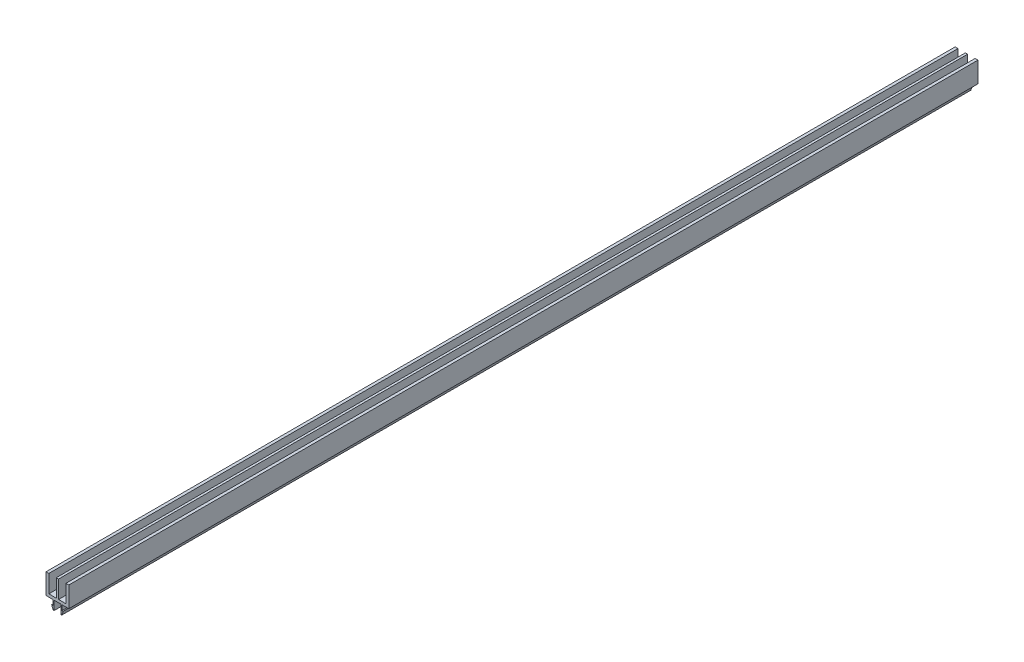
ISO-10303-21;
HEADER;
FILE_DESCRIPTION(('STEP AP214'),'2;1');
FILE_NAME('part.step','',(''),(''),'','','');
FILE_SCHEMA(('AUTOMOTIVE_DESIGN { 1 0 10303 214 1 1 1 1 }'));
ENDSEC;
DATA;
#1=APPLICATION_CONTEXT('core data for automotive mechanical design processes');
#2=APPLICATION_PROTOCOL_DEFINITION('international standard','automotive_design',2000,#1);
#3=PRODUCT_CONTEXT('',#1,'mechanical');
#4=PRODUCT('Part','Part','',(#3));
#5=PRODUCT_RELATED_PRODUCT_CATEGORY('part','',(#4));
#6=PRODUCT_DEFINITION_FORMATION('','',#4);
#7=PRODUCT_DEFINITION_CONTEXT('part definition',#1,'design');
#8=PRODUCT_DEFINITION('design','',#6,#7);
#9=PRODUCT_DEFINITION_SHAPE('','',#8);
#10=(LENGTH_UNIT() NAMED_UNIT(*) SI_UNIT(.MILLI.,.METRE.));
#11=(NAMED_UNIT(*) PLANE_ANGLE_UNIT() SI_UNIT($,.RADIAN.));
#12=(NAMED_UNIT(*) SI_UNIT($,.STERADIAN.) SOLID_ANGLE_UNIT());
#13=UNCERTAINTY_MEASURE_WITH_UNIT(LENGTH_MEASURE(1.E-05),#10,'distance_accuracy_value','');
#14=(GEOMETRIC_REPRESENTATION_CONTEXT(3) GLOBAL_UNCERTAINTY_ASSIGNED_CONTEXT((#13)) GLOBAL_UNIT_ASSIGNED_CONTEXT((#10,
#11,#12)) REPRESENTATION_CONTEXT('',''));
#15=CARTESIAN_POINT('',(0.,0.,0.));
#16=DIRECTION('',(0.,0.,1.));
#17=DIRECTION('',(1.,0.,0.));
#18=AXIS2_PLACEMENT_3D('',#15,#16,#17);
#19=CARTESIAN_POINT('',(-1.,17.9999999975,-746.));
#20=DIRECTION('',(-1.,0.,0.));
#21=DIRECTION('',(0.,-1.,0.));
#22=AXIS2_PLACEMENT_3D('',#19,#20,#21);
#23=PLANE('',#22);
#24=DIRECTION('',(0.,-1.,0.));
#25=VECTOR('',#24,1.);
#26=CARTESIAN_POINT('',(-1.,17.9999999975,50.));
#27=LINE('',#26,#25);
#28=CARTESIAN_POINT('',(-1.,17.9999999975,50.));
#29=VERTEX_POINT('',#28);
#30=CARTESIAN_POINT('',(-1.,2.4999999995,50.));
#31=VERTEX_POINT('',#30);
#32=EDGE_CURVE('E226',#29,#31,#27,.T.);
#33=ORIENTED_EDGE('',*,*,#32,.F.);
#34=DIRECTION('',(0.,0.,1.));
#35=VECTOR('',#34,1.);
#36=CARTESIAN_POINT('',(-1.,17.9999999975,-746.));
#37=LINE('',#36,#35);
#38=CARTESIAN_POINT('',(-1.,17.9999999975,-746.));
#39=VERTEX_POINT('',#38);
#40=EDGE_CURVE('E11',#39,#29,#37,.T.);
#41=ORIENTED_EDGE('',*,*,#40,.F.);
#42=DIRECTION('',(0.,-1.,0.));
#43=VECTOR('',#42,1.);
#44=CARTESIAN_POINT('',(-1.,17.9999999975,-746.));
#45=LINE('',#44,#43);
#46=CARTESIAN_POINT('',(-1.,2.4999999995,-746.));
#47=VERTEX_POINT('',#46);
#48=EDGE_CURVE('E294',#39,#47,#45,.T.);
#49=ORIENTED_EDGE('',*,*,#48,.T.);
#50=DIRECTION('',(0.,0.,1.));
#51=VECTOR('',#50,1.);
#52=CARTESIAN_POINT('',(-1.,2.4999999995,-746.));
#53=LINE('',#52,#51);
#54=EDGE_CURVE('E36',#47,#31,#53,.T.);
#55=ORIENTED_EDGE('',*,*,#54,.T.);
#56=EDGE_LOOP('',(#33,#41,#49,#55));
#57=FACE_BOUND('',#56,.T.);
#58=ADVANCED_FACE('F33',(#57),#23,.T.);
#59=CARTESIAN_POINT('',(0.999999999999998,17.9999999975,-746.));
#60=DIRECTION('',(0.,1.,0.));
#61=DIRECTION('',(0.,0.,1.));
#62=AXIS2_PLACEMENT_3D('',#59,#60,#61);
#63=PLANE('',#62);
#64=DIRECTION('',(-1.,0.,0.));
#65=VECTOR('',#64,1.);
#66=CARTESIAN_POINT('',(0.999999999999998,17.9999999975,50.));
#67=LINE('',#66,#65);
#68=CARTESIAN_POINT('',(0.999999999999998,17.9999999975,50.));
#69=VERTEX_POINT('',#68);
#70=EDGE_CURVE('E292',#69,#29,#67,.T.);
#71=ORIENTED_EDGE('',*,*,#70,.F.);
#72=DIRECTION('',(0.,0.,1.));
#73=VECTOR('',#72,1.);
#74=CARTESIAN_POINT('',(0.999999999999998,17.9999999975,-746.));
#75=LINE('',#74,#73);
#76=CARTESIAN_POINT('',(0.999999999999998,17.9999999975,-746.));
#77=VERTEX_POINT('',#76);
#78=EDGE_CURVE('E42',#77,#69,#75,.T.);
#79=ORIENTED_EDGE('',*,*,#78,.F.);
#80=DIRECTION('',(-1.,0.,0.));
#81=VECTOR('',#80,1.);
#82=CARTESIAN_POINT('',(0.999999999999998,17.9999999975,-746.));
#83=LINE('',#82,#81);
#84=EDGE_CURVE('E216',#77,#39,#83,.T.);
#85=ORIENTED_EDGE('',*,*,#84,.T.);
#86=ORIENTED_EDGE('',*,*,#40,.T.);
#87=EDGE_LOOP('',(#71,#79,#85,#86));
#88=FACE_BOUND('',#87,.T.);
#89=ADVANCED_FACE('F338',(#88),#63,.T.);
#90=CARTESIAN_POINT('',(0.999999999999998,2.4999999995,-746.));
#91=DIRECTION('',(1.,0.,0.));
#92=DIRECTION('',(0.,0.,-1.));
#93=AXIS2_PLACEMENT_3D('',#90,#91,#92);
#94=PLANE('',#93);
#95=DIRECTION('',(0.,1.,0.));
#96=VECTOR('',#95,1.);
#97=CARTESIAN_POINT('',(0.999999999999998,2.4999999995,50.));
#98=LINE('',#97,#96);
#99=CARTESIAN_POINT('',(0.999999999999998,2.4999999995,50.));
#100=VERTEX_POINT('',#99);
#101=EDGE_CURVE('E203',#100,#69,#98,.T.);
#102=ORIENTED_EDGE('',*,*,#101,.F.);
#103=DIRECTION('',(0.,0.,1.));
#104=VECTOR('',#103,1.);
#105=CARTESIAN_POINT('',(0.999999999999998,2.4999999995,-746.));
#106=LINE('',#105,#104);
#107=CARTESIAN_POINT('',(0.999999999999998,2.4999999995,-746.));
#108=VERTEX_POINT('',#107);
#109=EDGE_CURVE('E198',#108,#100,#106,.T.);
#110=ORIENTED_EDGE('',*,*,#109,.F.);
#111=DIRECTION('',(0.,1.,0.));
#112=VECTOR('',#111,1.);
#113=CARTESIAN_POINT('',(0.999999999999998,2.4999999995,-746.));
#114=LINE('',#113,#112);
#115=EDGE_CURVE('E201',#108,#77,#114,.T.);
#116=ORIENTED_EDGE('',*,*,#115,.T.);
#117=ORIENTED_EDGE('',*,*,#78,.T.);
#118=EDGE_LOOP('',(#102,#110,#116,#117));
#119=FACE_BOUND('',#118,.T.);
#120=ADVANCED_FACE('F200',(#119),#94,.T.);
#121=CARTESIAN_POINT('',(7.5,2.4999999995,-746.));
#122=DIRECTION('',(0.,1.,0.));
#123=DIRECTION('',(-1.,0.,0.));
#124=AXIS2_PLACEMENT_3D('',#121,#122,#123);
#125=PLANE('',#124);
#126=DIRECTION('',(-1.,0.,0.));
#127=VECTOR('',#126,1.);
#128=CARTESIAN_POINT('',(7.5,2.4999999995,50.));
#129=LINE('',#128,#127);
#130=CARTESIAN_POINT('',(7.5,2.4999999995,50.));
#131=VERTEX_POINT('',#130);
#132=EDGE_CURVE('E289',#131,#100,#129,.T.);
#133=ORIENTED_EDGE('',*,*,#132,.F.);
#134=DIRECTION('',(0.,0.,1.));
#135=VECTOR('',#134,1.);
#136=CARTESIAN_POINT('',(7.5,2.4999999995,-746.));
#137=LINE('',#136,#135);
#138=CARTESIAN_POINT('',(7.5,2.4999999995,-746.));
#139=VERTEX_POINT('',#138);
#140=EDGE_CURVE('E208',#139,#131,#137,.T.);
#141=ORIENTED_EDGE('',*,*,#140,.F.);
#142=DIRECTION('',(-1.,0.,0.));
#143=VECTOR('',#142,1.);
#144=CARTESIAN_POINT('',(7.5,2.4999999995,-746.));
#145=LINE('',#144,#143);
#146=EDGE_CURVE('E214',#139,#108,#145,.T.);
#147=ORIENTED_EDGE('',*,*,#146,.T.);
#148=ORIENTED_EDGE('',*,*,#109,.T.);
#149=EDGE_LOOP('',(#133,#141,#147,#148));
#150=FACE_BOUND('',#149,.T.);
#151=ADVANCED_FACE('F218',(#150),#125,.T.);
#152=CARTESIAN_POINT('',(7.5,17.9999999975,-746.));
#153=DIRECTION('',(-1.,0.,0.));
#154=DIRECTION('',(0.,-1.,0.));
#155=AXIS2_PLACEMENT_3D('',#152,#153,#154);
#156=PLANE('',#155);
#157=DIRECTION('',(0.,-1.,0.));
#158=VECTOR('',#157,1.);
#159=CARTESIAN_POINT('',(7.5,17.9999999975,50.));
#160=LINE('',#159,#158);
#161=CARTESIAN_POINT('',(7.5,17.9999999975,50.));
#162=VERTEX_POINT('',#161);
#163=EDGE_CURVE('E286',#162,#131,#160,.T.);
#164=ORIENTED_EDGE('',*,*,#163,.F.);
#165=DIRECTION('',(0.,0.,1.));
#166=VECTOR('',#165,1.);
#167=CARTESIAN_POINT('',(7.5,17.9999999975,-746.));
#168=LINE('',#167,#166);
#169=CARTESIAN_POINT('',(7.5,17.9999999975,-746.));
#170=VERTEX_POINT('',#169);
#171=EDGE_CURVE('E298',#170,#162,#168,.T.);
#172=ORIENTED_EDGE('',*,*,#171,.F.);
#173=DIRECTION('',(0.,-1.,0.));
#174=VECTOR('',#173,1.);
#175=CARTESIAN_POINT('',(7.5,17.9999999975,-746.));
#176=LINE('',#175,#174);
#177=EDGE_CURVE('E219',#170,#139,#176,.T.);
#178=ORIENTED_EDGE('',*,*,#177,.T.);
#179=ORIENTED_EDGE('',*,*,#140,.T.);
#180=EDGE_LOOP('',(#164,#172,#178,#179));
#181=FACE_BOUND('',#180,.T.);
#182=ADVANCED_FACE('F351',(#181),#156,.T.);
#183=CARTESIAN_POINT('',(10.,17.9999999975,-746.));
#184=DIRECTION('',(0.,1.,0.));
#185=DIRECTION('',(0.,0.,1.));
#186=AXIS2_PLACEMENT_3D('',#183,#184,#185);
#187=PLANE('',#186);
#188=DIRECTION('',(-1.,0.,0.));
#189=VECTOR('',#188,1.);
#190=CARTESIAN_POINT('',(10.,17.9999999975,50.));
#191=LINE('',#190,#189);
#192=CARTESIAN_POINT('',(10.,17.9999999975,50.));
#193=VERTEX_POINT('',#192);
#194=EDGE_CURVE('E283',#193,#162,#191,.T.);
#195=ORIENTED_EDGE('',*,*,#194,.F.);
#196=DIRECTION('',(0.,0.,1.));
#197=VECTOR('',#196,1.);
#198=CARTESIAN_POINT('',(10.,17.9999999975,-746.));
#199=LINE('',#198,#197);
#200=CARTESIAN_POINT('',(10.,17.9999999975,-746.));
#201=VERTEX_POINT('',#200);
#202=EDGE_CURVE('E300',#201,#193,#199,.T.);
#203=ORIENTED_EDGE('',*,*,#202,.F.);
#204=DIRECTION('',(-1.,0.,0.));
#205=VECTOR('',#204,1.);
#206=CARTESIAN_POINT('',(10.,17.9999999975,-746.));
#207=LINE('',#206,#205);
#208=EDGE_CURVE('E221',#201,#170,#207,.T.);
#209=ORIENTED_EDGE('',*,*,#208,.T.);
#210=ORIENTED_EDGE('',*,*,#171,.T.);
#211=EDGE_LOOP('',(#195,#203,#209,#210));
#212=FACE_BOUND('',#211,.T.);
#213=ADVANCED_FACE('F354',(#212),#187,.T.);
#214=CARTESIAN_POINT('',(10.,-4.99999828349541E-10,-746.));
#215=DIRECTION('',(1.,0.,0.));
#216=DIRECTION('',(0.,0.,-1.));
#217=AXIS2_PLACEMENT_3D('',#214,#215,#216);
#218=PLANE('',#217);
#219=DIRECTION('',(0.,1.,0.));
#220=VECTOR('',#219,1.);
#221=CARTESIAN_POINT('',(10.,-4.99999828349541E-10,50.));
#222=LINE('',#221,#220);
#223=CARTESIAN_POINT('',(10.,-4.99999828349541E-10,50.));
#224=VERTEX_POINT('',#223);
#225=EDGE_CURVE('E280',#224,#193,#222,.T.);
#226=ORIENTED_EDGE('',*,*,#225,.F.);
#227=DIRECTION('',(0.,0.,1.));
#228=VECTOR('',#227,1.);
#229=CARTESIAN_POINT('',(10.,-4.99999828349541E-10,-746.));
#230=LINE('',#229,#228);
#231=CARTESIAN_POINT('',(10.,-4.99999828349541E-10,-746.));
#232=VERTEX_POINT('',#231);
#233=EDGE_CURVE('E302',#232,#224,#230,.T.);
#234=ORIENTED_EDGE('',*,*,#233,.F.);
#235=DIRECTION('',(0.,1.,0.));
#236=VECTOR('',#235,1.);
#237=CARTESIAN_POINT('',(10.,-4.99999828349541E-10,-746.));
#238=LINE('',#237,#236);
#239=EDGE_CURVE('E644',#232,#201,#238,.T.);
#240=ORIENTED_EDGE('',*,*,#239,.T.);
#241=ORIENTED_EDGE('',*,*,#202,.T.);
#242=EDGE_LOOP('',(#226,#234,#240,#241));
#243=FACE_BOUND('',#242,.T.);
#244=ADVANCED_FACE('F358',(#243),#218,.T.);
#245=CARTESIAN_POINT('',(4.,-4.99999998002099E-10,-746.));
#246=DIRECTION('',(0.,-1.,0.));
#247=DIRECTION('',(1.,0.,0.));
#248=AXIS2_PLACEMENT_3D('',#245,#246,#247);
#249=PLANE('',#248);
#250=DIRECTION('',(1.,0.,0.));
#251=VECTOR('',#250,1.);
#252=CARTESIAN_POINT('',(4.,-4.99999998002099E-10,50.));
#253=LINE('',#252,#251);
#254=CARTESIAN_POINT('',(4.,-4.99999998002099E-10,50.));
#255=VERTEX_POINT('',#254);
#256=EDGE_CURVE('E277',#255,#224,#253,.T.);
#257=ORIENTED_EDGE('',*,*,#256,.F.);
#258=DIRECTION('',(0.,0.,1.));
#259=VECTOR('',#258,1.);
#260=CARTESIAN_POINT('',(4.,-4.99999998002099E-10,-746.));
#261=LINE('',#260,#259);
#262=CARTESIAN_POINT('',(4.,-4.99999998002099E-10,-746.));
#263=VERTEX_POINT('',#262);
#264=EDGE_CURVE('E304',#263,#255,#261,.T.);
#265=ORIENTED_EDGE('',*,*,#264,.F.);
#266=DIRECTION('',(1.,0.,0.));
#267=VECTOR('',#266,1.);
#268=CARTESIAN_POINT('',(4.,-4.99999998002099E-10,-746.));
#269=LINE('',#268,#267);
#270=EDGE_CURVE('E648',#263,#232,#269,.T.);
#271=ORIENTED_EDGE('',*,*,#270,.T.);
#272=ORIENTED_EDGE('',*,*,#233,.T.);
#273=EDGE_LOOP('',(#257,#265,#271,#272));
#274=FACE_BOUND('',#273,.T.);
#275=ADVANCED_FACE('F362',(#274),#249,.T.);
#276=CARTESIAN_POINT('',(4.,-4.5,-746.));
#277=DIRECTION('',(1.,0.,0.));
#278=DIRECTION('',(0.,0.,-1.));
#279=AXIS2_PLACEMENT_3D('',#276,#277,#278);
#280=PLANE('',#279);
#281=DIRECTION('',(0.,1.,0.));
#282=VECTOR('',#281,1.);
#283=CARTESIAN_POINT('',(4.,-4.5,50.));
#284=LINE('',#283,#282);
#285=CARTESIAN_POINT('',(4.,-4.5,50.));
#286=VERTEX_POINT('',#285);
#287=EDGE_CURVE('E274',#286,#255,#284,.T.);
#288=ORIENTED_EDGE('',*,*,#287,.F.);
#289=DIRECTION('',(0.,0.,1.));
#290=VECTOR('',#289,1.);
#291=CARTESIAN_POINT('',(4.,-4.5,-746.));
#292=LINE('',#291,#290);
#293=CARTESIAN_POINT('',(4.,-4.5,-746.));
#294=VERTEX_POINT('',#293);
#295=EDGE_CURVE('E306',#294,#286,#292,.T.);
#296=ORIENTED_EDGE('',*,*,#295,.F.);
#297=DIRECTION('',(0.,1.,0.));
#298=VECTOR('',#297,1.);
#299=CARTESIAN_POINT('',(4.,-4.5,-746.));
#300=LINE('',#299,#298);
#301=EDGE_CURVE('E637',#294,#263,#300,.T.);
#302=ORIENTED_EDGE('',*,*,#301,.T.);
#303=ORIENTED_EDGE('',*,*,#264,.T.);
#304=EDGE_LOOP('',(#288,#296,#302,#303));
#305=FACE_BOUND('',#304,.T.);
#306=ADVANCED_FACE('F366',(#305),#280,.T.);
#307=CARTESIAN_POINT('',(5.,-4.5,-746.));
#308=DIRECTION('',(0.,1.,0.));
#309=DIRECTION('',(0.,0.,1.));
#310=AXIS2_PLACEMENT_3D('',#307,#308,#309);
#311=PLANE('',#310);
#312=DIRECTION('',(-1.,0.,0.));
#313=VECTOR('',#312,1.);
#314=CARTESIAN_POINT('',(5.,-4.5,50.));
#315=LINE('',#314,#313);
#316=CARTESIAN_POINT('',(5.,-4.5,50.));
#317=VERTEX_POINT('',#316);
#318=EDGE_CURVE('E271',#317,#286,#315,.T.);
#319=ORIENTED_EDGE('',*,*,#318,.F.);
#320=DIRECTION('',(0.,0.,1.));
#321=VECTOR('',#320,1.);
#322=CARTESIAN_POINT('',(5.,-4.5,-746.));
#323=LINE('',#322,#321);
#324=CARTESIAN_POINT('',(5.,-4.5,-746.));
#325=VERTEX_POINT('',#324);
#326=EDGE_CURVE('E308',#325,#317,#323,.T.);
#327=ORIENTED_EDGE('',*,*,#326,.F.);
#328=DIRECTION('',(-1.,0.,0.));
#329=VECTOR('',#328,1.);
#330=CARTESIAN_POINT('',(5.,-4.5,-746.));
#331=LINE('',#330,#329);
#332=EDGE_CURVE('E633',#325,#294,#331,.T.);
#333=ORIENTED_EDGE('',*,*,#332,.T.);
#334=ORIENTED_EDGE('',*,*,#295,.T.);
#335=EDGE_LOOP('',(#319,#327,#333,#334));
#336=FACE_BOUND('',#335,.T.);
#337=ADVANCED_FACE('F370',(#336),#311,.T.);
#338=CARTESIAN_POINT('',(3.75,-8.,-746.));
#339=DIRECTION('',(0.941741911594837,-0.336336396998156,0.));
#340=DIRECTION('',(0.336336396998157,0.941741911594838,0.));
#341=AXIS2_PLACEMENT_3D('',#338,#339,#340);
#342=PLANE('',#341);
#343=DIRECTION('',(0.336336396998157,0.941741911594837,0.));
#344=VECTOR('',#343,1.);
#345=CARTESIAN_POINT('',(3.75,-8.,50.));
#346=LINE('',#345,#344);
#347=CARTESIAN_POINT('',(3.75,-8.,50.));
#348=VERTEX_POINT('',#347);
#349=EDGE_CURVE('E268',#348,#317,#346,.T.);
#350=ORIENTED_EDGE('',*,*,#349,.F.);
#351=DIRECTION('',(0.,0.,1.));
#352=VECTOR('',#351,1.);
#353=CARTESIAN_POINT('',(3.75,-8.,-746.));
#354=LINE('',#353,#352);
#355=CARTESIAN_POINT('',(3.75,-8.,-746.));
#356=VERTEX_POINT('',#355);
#357=EDGE_CURVE('E310',#356,#348,#354,.T.);
#358=ORIENTED_EDGE('',*,*,#357,.F.);
#359=DIRECTION('',(0.336336396998157,0.941741911594837,0.));
#360=VECTOR('',#359,1.);
#361=CARTESIAN_POINT('',(3.75,-8.,-746.));
#362=LINE('',#361,#360);
#363=EDGE_CURVE('E654',#356,#325,#362,.T.);
#364=ORIENTED_EDGE('',*,*,#363,.T.);
#365=ORIENTED_EDGE('',*,*,#326,.T.);
#366=EDGE_LOOP('',(#350,#358,#364,#365));
#367=FACE_BOUND('',#366,.T.);
#368=ADVANCED_FACE('F374',(#367),#342,.T.);
#369=CARTESIAN_POINT('',(3.,-8.,-746.));
#370=DIRECTION('',(0.,-1.,0.));
#371=DIRECTION('',(0.,0.,-1.));
#372=AXIS2_PLACEMENT_3D('',#369,#370,#371);
#373=PLANE('',#372);
#374=DIRECTION('',(1.,0.,0.));
#375=VECTOR('',#374,1.);
#376=CARTESIAN_POINT('',(3.,-8.,50.));
#377=LINE('',#376,#375);
#378=CARTESIAN_POINT('',(3.,-8.,50.));
#379=VERTEX_POINT('',#378);
#380=EDGE_CURVE('E265',#379,#348,#377,.T.);
#381=ORIENTED_EDGE('',*,*,#380,.F.);
#382=DIRECTION('',(0.,0.,1.));
#383=VECTOR('',#382,1.);
#384=CARTESIAN_POINT('',(3.,-8.,-746.));
#385=LINE('',#384,#383);
#386=CARTESIAN_POINT('',(3.,-8.,-746.));
#387=VERTEX_POINT('',#386);
#388=EDGE_CURVE('E312',#387,#379,#385,.T.);
#389=ORIENTED_EDGE('',*,*,#388,.F.);
#390=DIRECTION('',(1.,0.,0.));
#391=VECTOR('',#390,1.);
#392=CARTESIAN_POINT('',(3.,-8.,-746.));
#393=LINE('',#392,#391);
#394=EDGE_CURVE('E626',#387,#356,#393,.T.);
#395=ORIENTED_EDGE('',*,*,#394,.T.);
#396=ORIENTED_EDGE('',*,*,#357,.T.);
#397=EDGE_LOOP('',(#381,#389,#395,#396));
#398=FACE_BOUND('',#397,.T.);
#399=ADVANCED_FACE('F378',(#398),#373,.T.);
#400=CARTESIAN_POINT('',(3.,-4.9999985194348E-10,-746.));
#401=DIRECTION('',(-1.,0.,0.));
#402=DIRECTION('',(0.,0.,1.));
#403=AXIS2_PLACEMENT_3D('',#400,#401,#402);
#404=PLANE('',#403);
#405=DIRECTION('',(0.,-1.,0.));
#406=VECTOR('',#405,1.);
#407=CARTESIAN_POINT('',(3.,-4.9999985194348E-10,50.));
#408=LINE('',#407,#406);
#409=CARTESIAN_POINT('',(3.,-4.9999985194348E-10,50.));
#410=VERTEX_POINT('',#409);
#411=EDGE_CURVE('E262',#410,#379,#408,.T.);
#412=ORIENTED_EDGE('',*,*,#411,.F.);
#413=DIRECTION('',(0.,0.,1.));
#414=VECTOR('',#413,1.);
#415=CARTESIAN_POINT('',(3.,-4.9999985194348E-10,-746.));
#416=LINE('',#415,#414);
#417=CARTESIAN_POINT('',(3.,-4.9999985194348E-10,-746.));
#418=VERTEX_POINT('',#417);
#419=EDGE_CURVE('E314',#418,#410,#416,.T.);
#420=ORIENTED_EDGE('',*,*,#419,.F.);
#421=DIRECTION('',(0.,-1.,0.));
#422=VECTOR('',#421,1.);
#423=CARTESIAN_POINT('',(3.,-4.9999985194348E-10,-746.));
#424=LINE('',#423,#422);
#425=EDGE_CURVE('E622',#418,#387,#424,.T.);
#426=ORIENTED_EDGE('',*,*,#425,.T.);
#427=ORIENTED_EDGE('',*,*,#388,.T.);
#428=EDGE_LOOP('',(#412,#420,#426,#427));
#429=FACE_BOUND('',#428,.T.);
#430=ADVANCED_FACE('F382',(#429),#404,.T.);
#431=CARTESIAN_POINT('',(-3.,-4.99999455901012E-10,-746.));
#432=DIRECTION('',(0.,-1.,0.));
#433=DIRECTION('',(1.,0.,0.));
#434=AXIS2_PLACEMENT_3D('',#431,#432,#433);
#435=PLANE('',#434);
#436=DIRECTION('',(1.,0.,0.));
#437=VECTOR('',#436,1.);
#438=CARTESIAN_POINT('',(-3.,-4.99999455901012E-10,50.));
#439=LINE('',#438,#437);
#440=CARTESIAN_POINT('',(-3.,-4.99999455901012E-10,50.));
#441=VERTEX_POINT('',#440);
#442=EDGE_CURVE('E259',#441,#410,#439,.T.);
#443=ORIENTED_EDGE('',*,*,#442,.F.);
#444=DIRECTION('',(0.,0.,1.));
#445=VECTOR('',#444,1.);
#446=CARTESIAN_POINT('',(-3.,-4.99999455901012E-10,-746.));
#447=LINE('',#446,#445);
#448=CARTESIAN_POINT('',(-3.,-4.99999455901012E-10,-746.));
#449=VERTEX_POINT('',#448);
#450=EDGE_CURVE('E316',#449,#441,#447,.T.);
#451=ORIENTED_EDGE('',*,*,#450,.F.);
#452=DIRECTION('',(1.,0.,0.));
#453=VECTOR('',#452,1.);
#454=CARTESIAN_POINT('',(-3.,-4.99999455901012E-10,-746.));
#455=LINE('',#454,#453);
#456=EDGE_CURVE('E658',#449,#418,#455,.T.);
#457=ORIENTED_EDGE('',*,*,#456,.T.);
#458=ORIENTED_EDGE('',*,*,#419,.T.);
#459=EDGE_LOOP('',(#443,#451,#457,#458));
#460=FACE_BOUND('',#459,.T.);
#461=ADVANCED_FACE('F386',(#460),#435,.T.);
#462=CARTESIAN_POINT('',(-3.,-8.,-746.));
#463=DIRECTION('',(1.,0.,0.));
#464=DIRECTION('',(0.,0.,-1.));
#465=AXIS2_PLACEMENT_3D('',#462,#463,#464);
#466=PLANE('',#465);
#467=DIRECTION('',(0.,1.,0.));
#468=VECTOR('',#467,1.);
#469=CARTESIAN_POINT('',(-3.,-8.,50.));
#470=LINE('',#469,#468);
#471=CARTESIAN_POINT('',(-3.,-8.,50.));
#472=VERTEX_POINT('',#471);
#473=EDGE_CURVE('E256',#472,#441,#470,.T.);
#474=ORIENTED_EDGE('',*,*,#473,.F.);
#475=DIRECTION('',(0.,0.,1.));
#476=VECTOR('',#475,1.);
#477=CARTESIAN_POINT('',(-3.,-8.,-746.));
#478=LINE('',#477,#476);
#479=CARTESIAN_POINT('',(-3.,-8.,-746.));
#480=VERTEX_POINT('',#479);
#481=EDGE_CURVE('E318',#480,#472,#478,.T.);
#482=ORIENTED_EDGE('',*,*,#481,.F.);
#483=DIRECTION('',(0.,1.,0.));
#484=VECTOR('',#483,1.);
#485=CARTESIAN_POINT('',(-3.,-8.,-746.));
#486=LINE('',#485,#484);
#487=EDGE_CURVE('E615',#480,#449,#486,.T.);
#488=ORIENTED_EDGE('',*,*,#487,.T.);
#489=ORIENTED_EDGE('',*,*,#450,.T.);
#490=EDGE_LOOP('',(#474,#482,#488,#489));
#491=FACE_BOUND('',#490,.T.);
#492=ADVANCED_FACE('F390',(#491),#466,.T.);
#493=CARTESIAN_POINT('',(-3.75,-8.,-746.));
#494=DIRECTION('',(0.,-1.,0.));
#495=DIRECTION('',(0.,0.,-1.));
#496=AXIS2_PLACEMENT_3D('',#493,#494,#495);
#497=PLANE('',#496);
#498=DIRECTION('',(1.,0.,0.));
#499=VECTOR('',#498,1.);
#500=CARTESIAN_POINT('',(-3.75,-8.,50.));
#501=LINE('',#500,#499);
#502=CARTESIAN_POINT('',(-3.75,-8.,50.));
#503=VERTEX_POINT('',#502);
#504=EDGE_CURVE('E253',#503,#472,#501,.T.);
#505=ORIENTED_EDGE('',*,*,#504,.F.);
#506=DIRECTION('',(0.,0.,1.));
#507=VECTOR('',#506,1.);
#508=CARTESIAN_POINT('',(-3.75,-8.,-746.));
#509=LINE('',#508,#507);
#510=CARTESIAN_POINT('',(-3.75,-8.,-746.));
#511=VERTEX_POINT('',#510);
#512=EDGE_CURVE('E320',#511,#503,#509,.T.);
#513=ORIENTED_EDGE('',*,*,#512,.F.);
#514=DIRECTION('',(1.,0.,0.));
#515=VECTOR('',#514,1.);
#516=CARTESIAN_POINT('',(-3.75,-8.,-746.));
#517=LINE('',#516,#515);
#518=EDGE_CURVE('E611',#511,#480,#517,.T.);
#519=ORIENTED_EDGE('',*,*,#518,.T.);
#520=ORIENTED_EDGE('',*,*,#481,.T.);
#521=EDGE_LOOP('',(#505,#513,#519,#520));
#522=FACE_BOUND('',#521,.T.);
#523=ADVANCED_FACE('F394',(#522),#497,.T.);
#524=CARTESIAN_POINT('',(-5.,-4.5,-746.));
#525=DIRECTION('',(-0.941741911594837,-0.336336396998156,0.));
#526=DIRECTION('',(0.336336396998156,-0.941741911594838,0.));
#527=AXIS2_PLACEMENT_3D('',#524,#525,#526);
#528=PLANE('',#527);
#529=DIRECTION('',(0.336336396998156,-0.941741911594837,0.));
#530=VECTOR('',#529,1.);
#531=CARTESIAN_POINT('',(-5.,-4.5,50.));
#532=LINE('',#531,#530);
#533=CARTESIAN_POINT('',(-5.,-4.5,50.));
#534=VERTEX_POINT('',#533);
#535=EDGE_CURVE('E250',#534,#503,#532,.T.);
#536=ORIENTED_EDGE('',*,*,#535,.F.);
#537=DIRECTION('',(0.,0.,1.));
#538=VECTOR('',#537,1.);
#539=CARTESIAN_POINT('',(-5.,-4.5,-746.));
#540=LINE('',#539,#538);
#541=CARTESIAN_POINT('',(-5.,-4.5,-746.));
#542=VERTEX_POINT('',#541);
#543=EDGE_CURVE('E322',#542,#534,#540,.T.);
#544=ORIENTED_EDGE('',*,*,#543,.F.);
#545=DIRECTION('',(0.336336396998156,-0.941741911594837,0.));
#546=VECTOR('',#545,1.);
#547=CARTESIAN_POINT('',(-5.,-4.5,-746.));
#548=LINE('',#547,#546);
#549=EDGE_CURVE('E662',#542,#511,#548,.T.);
#550=ORIENTED_EDGE('',*,*,#549,.T.);
#551=ORIENTED_EDGE('',*,*,#512,.T.);
#552=EDGE_LOOP('',(#536,#544,#550,#551));
#553=FACE_BOUND('',#552,.T.);
#554=ADVANCED_FACE('F398',(#553),#528,.T.);
#555=CARTESIAN_POINT('',(-4.,-4.5,-746.));
#556=DIRECTION('',(0.,1.,0.));
#557=DIRECTION('',(0.,0.,1.));
#558=AXIS2_PLACEMENT_3D('',#555,#556,#557);
#559=PLANE('',#558);
#560=DIRECTION('',(-1.,0.,0.));
#561=VECTOR('',#560,1.);
#562=CARTESIAN_POINT('',(-4.,-4.5,50.));
#563=LINE('',#562,#561);
#564=CARTESIAN_POINT('',(-4.,-4.5,50.));
#565=VERTEX_POINT('',#564);
#566=EDGE_CURVE('E247',#565,#534,#563,.T.);
#567=ORIENTED_EDGE('',*,*,#566,.F.);
#568=DIRECTION('',(0.,0.,1.));
#569=VECTOR('',#568,1.);
#570=CARTESIAN_POINT('',(-4.,-4.5,-746.));
#571=LINE('',#570,#569);
#572=CARTESIAN_POINT('',(-4.,-4.5,-746.));
#573=VERTEX_POINT('',#572);
#574=EDGE_CURVE('E324',#573,#565,#571,.T.);
#575=ORIENTED_EDGE('',*,*,#574,.F.);
#576=DIRECTION('',(-1.,0.,0.));
#577=VECTOR('',#576,1.);
#578=CARTESIAN_POINT('',(-4.,-4.5,-746.));
#579=LINE('',#578,#577);
#580=EDGE_CURVE('E604',#573,#542,#579,.T.);
#581=ORIENTED_EDGE('',*,*,#580,.T.);
#582=ORIENTED_EDGE('',*,*,#543,.T.);
#583=EDGE_LOOP('',(#567,#575,#581,#582));
#584=FACE_BOUND('',#583,.T.);
#585=ADVANCED_FACE('F402',(#584),#559,.T.);
#586=CARTESIAN_POINT('',(-4.,-4.9999985194348E-10,-746.));
#587=DIRECTION('',(-1.,0.,0.));
#588=DIRECTION('',(0.,0.,1.));
#589=AXIS2_PLACEMENT_3D('',#586,#587,#588);
#590=PLANE('',#589);
#591=DIRECTION('',(0.,-1.,0.));
#592=VECTOR('',#591,1.);
#593=CARTESIAN_POINT('',(-4.,-4.9999985194348E-10,50.));
#594=LINE('',#593,#592);
#595=CARTESIAN_POINT('',(-4.,-4.9999985194348E-10,50.));
#596=VERTEX_POINT('',#595);
#597=EDGE_CURVE('E244',#596,#565,#594,.T.);
#598=ORIENTED_EDGE('',*,*,#597,.F.);
#599=DIRECTION('',(0.,0.,1.));
#600=VECTOR('',#599,1.);
#601=CARTESIAN_POINT('',(-4.,-4.9999985194348E-10,-746.));
#602=LINE('',#601,#600);
#603=CARTESIAN_POINT('',(-4.,-4.9999985194348E-10,-746.));
#604=VERTEX_POINT('',#603);
#605=EDGE_CURVE('E326',#604,#596,#602,.T.);
#606=ORIENTED_EDGE('',*,*,#605,.F.);
#607=DIRECTION('',(0.,-1.,0.));
#608=VECTOR('',#607,1.);
#609=CARTESIAN_POINT('',(-4.,-4.9999985194348E-10,-746.));
#610=LINE('',#609,#608);
#611=EDGE_CURVE('E600',#604,#573,#610,.T.);
#612=ORIENTED_EDGE('',*,*,#611,.T.);
#613=ORIENTED_EDGE('',*,*,#574,.T.);
#614=EDGE_LOOP('',(#598,#606,#612,#613));
#615=FACE_BOUND('',#614,.T.);
#616=ADVANCED_FACE('F406',(#615),#590,.T.);
#617=CARTESIAN_POINT('',(-10.,-4.99999719929324E-10,-746.));
#618=DIRECTION('',(0.,-1.,0.));
#619=DIRECTION('',(1.,0.,0.));
#620=AXIS2_PLACEMENT_3D('',#617,#618,#619);
#621=PLANE('',#620);
#622=DIRECTION('',(1.,0.,0.));
#623=VECTOR('',#622,1.);
#624=CARTESIAN_POINT('',(-10.,-4.99999719929324E-10,50.));
#625=LINE('',#624,#623);
#626=CARTESIAN_POINT('',(-10.,-4.99999719929324E-10,50.));
#627=VERTEX_POINT('',#626);
#628=EDGE_CURVE('E241',#627,#596,#625,.T.);
#629=ORIENTED_EDGE('',*,*,#628,.F.);
#630=DIRECTION('',(0.,0.,1.));
#631=VECTOR('',#630,1.);
#632=CARTESIAN_POINT('',(-10.,-4.99999719929324E-10,-746.));
#633=LINE('',#632,#631);
#634=CARTESIAN_POINT('',(-10.,-4.99999719929324E-10,-746.));
#635=VERTEX_POINT('',#634);
#636=EDGE_CURVE('E328',#635,#627,#633,.T.);
#637=ORIENTED_EDGE('',*,*,#636,.F.);
#638=DIRECTION('',(1.,0.,0.));
#639=VECTOR('',#638,1.);
#640=CARTESIAN_POINT('',(-10.,-4.99999719929324E-10,-746.));
#641=LINE('',#640,#639);
#642=EDGE_CURVE('E666',#635,#604,#641,.T.);
#643=ORIENTED_EDGE('',*,*,#642,.T.);
#644=ORIENTED_EDGE('',*,*,#605,.T.);
#645=EDGE_LOOP('',(#629,#637,#643,#644));
#646=FACE_BOUND('',#645,.T.);
#647=ADVANCED_FACE('F410',(#646),#621,.T.);
#648=CARTESIAN_POINT('',(-10.,17.9999999975,-746.));
#649=DIRECTION('',(-1.,0.,0.));
#650=DIRECTION('',(0.,-1.,0.));
#651=AXIS2_PLACEMENT_3D('',#648,#649,#650);
#652=PLANE('',#651);
#653=DIRECTION('',(0.,-1.,0.));
#654=VECTOR('',#653,1.);
#655=CARTESIAN_POINT('',(-10.,17.9999999975,50.));
#656=LINE('',#655,#654);
#657=CARTESIAN_POINT('',(-10.,17.9999999975,50.));
#658=VERTEX_POINT('',#657);
#659=EDGE_CURVE('E238',#658,#627,#656,.T.);
#660=ORIENTED_EDGE('',*,*,#659,.F.);
#661=DIRECTION('',(0.,0.,1.));
#662=VECTOR('',#661,1.);
#663=CARTESIAN_POINT('',(-10.,17.9999999975,-746.));
#664=LINE('',#663,#662);
#665=CARTESIAN_POINT('',(-10.,17.9999999975,-746.));
#666=VERTEX_POINT('',#665);
#667=EDGE_CURVE('E330',#666,#658,#664,.T.);
#668=ORIENTED_EDGE('',*,*,#667,.F.);
#669=DIRECTION('',(0.,-1.,0.));
#670=VECTOR('',#669,1.);
#671=CARTESIAN_POINT('',(-10.,17.9999999975,-746.));
#672=LINE('',#671,#670);
#673=EDGE_CURVE('E593',#666,#635,#672,.T.);
#674=ORIENTED_EDGE('',*,*,#673,.T.);
#675=ORIENTED_EDGE('',*,*,#636,.T.);
#676=EDGE_LOOP('',(#660,#668,#674,#675));
#677=FACE_BOUND('',#676,.T.);
#678=ADVANCED_FACE('F414',(#677),#652,.T.);
#679=CARTESIAN_POINT('',(-7.5,17.9999999975,-746.));
#680=DIRECTION('',(0.,1.,0.));
#681=DIRECTION('',(0.,0.,1.));
#682=AXIS2_PLACEMENT_3D('',#679,#680,#681);
#683=PLANE('',#682);
#684=DIRECTION('',(-1.,0.,0.));
#685=VECTOR('',#684,1.);
#686=CARTESIAN_POINT('',(-7.5,17.9999999975,50.));
#687=LINE('',#686,#685);
#688=CARTESIAN_POINT('',(-7.5,17.9999999975,50.));
#689=VERTEX_POINT('',#688);
#690=EDGE_CURVE('E235',#689,#658,#687,.T.);
#691=ORIENTED_EDGE('',*,*,#690,.F.);
#692=DIRECTION('',(0.,0.,1.));
#693=VECTOR('',#692,1.);
#694=CARTESIAN_POINT('',(-7.5,17.9999999975,-746.));
#695=LINE('',#694,#693);
#696=CARTESIAN_POINT('',(-7.5,17.9999999975,-746.));
#697=VERTEX_POINT('',#696);
#698=EDGE_CURVE('E332',#697,#689,#695,.T.);
#699=ORIENTED_EDGE('',*,*,#698,.F.);
#700=DIRECTION('',(-1.,0.,0.));
#701=VECTOR('',#700,1.);
#702=CARTESIAN_POINT('',(-7.5,17.9999999975,-746.));
#703=LINE('',#702,#701);
#704=EDGE_CURVE('E589',#697,#666,#703,.T.);
#705=ORIENTED_EDGE('',*,*,#704,.T.);
#706=ORIENTED_EDGE('',*,*,#667,.T.);
#707=EDGE_LOOP('',(#691,#699,#705,#706));
#708=FACE_BOUND('',#707,.T.);
#709=ADVANCED_FACE('F418',(#708),#683,.T.);
#710=CARTESIAN_POINT('',(-7.5,2.4999999995,-746.));
#711=DIRECTION('',(1.,0.,0.));
#712=DIRECTION('',(0.,0.,-1.));
#713=AXIS2_PLACEMENT_3D('',#710,#711,#712);
#714=PLANE('',#713);
#715=DIRECTION('',(0.,1.,0.));
#716=VECTOR('',#715,1.);
#717=CARTESIAN_POINT('',(-7.5,2.4999999995,50.));
#718=LINE('',#717,#716);
#719=CARTESIAN_POINT('',(-7.5,2.4999999995,50.));
#720=VERTEX_POINT('',#719);
#721=EDGE_CURVE('E232',#720,#689,#718,.T.);
#722=ORIENTED_EDGE('',*,*,#721,.F.);
#723=DIRECTION('',(0.,0.,1.));
#724=VECTOR('',#723,1.);
#725=CARTESIAN_POINT('',(-7.5,2.4999999995,-746.));
#726=LINE('',#725,#724);
#727=CARTESIAN_POINT('',(-7.5,2.4999999995,-746.));
#728=VERTEX_POINT('',#727);
#729=EDGE_CURVE('E333',#728,#720,#726,.T.);
#730=ORIENTED_EDGE('',*,*,#729,.F.);
#731=DIRECTION('',(0.,1.,0.));
#732=VECTOR('',#731,1.);
#733=CARTESIAN_POINT('',(-7.5,2.4999999995,-746.));
#734=LINE('',#733,#732);
#735=EDGE_CURVE('E670',#728,#697,#734,.T.);
#736=ORIENTED_EDGE('',*,*,#735,.T.);
#737=ORIENTED_EDGE('',*,*,#698,.T.);
#738=EDGE_LOOP('',(#722,#730,#736,#737));
#739=FACE_BOUND('',#738,.T.);
#740=ADVANCED_FACE('F422',(#739),#714,.T.);
#741=CARTESIAN_POINT('',(-1.,2.4999999995,-746.));
#742=DIRECTION('',(0.,1.,0.));
#743=DIRECTION('',(-1.,0.,0.));
#744=AXIS2_PLACEMENT_3D('',#741,#742,#743);
#745=PLANE('',#744);
#746=DIRECTION('',(-1.,0.,0.));
#747=VECTOR('',#746,1.);
#748=CARTESIAN_POINT('',(-1.,2.4999999995,50.));
#749=LINE('',#748,#747);
#750=EDGE_CURVE('E229',#31,#720,#749,.T.);
#751=ORIENTED_EDGE('',*,*,#750,.F.);
#752=ORIENTED_EDGE('',*,*,#54,.F.);
#753=DIRECTION('',(-1.,0.,0.));
#754=VECTOR('',#753,1.);
#755=CARTESIAN_POINT('',(-1.,2.4999999995,-746.));
#756=LINE('',#755,#754);
#757=EDGE_CURVE('E672',#47,#728,#756,.T.);
#758=ORIENTED_EDGE('',*,*,#757,.T.);
#759=ORIENTED_EDGE('',*,*,#729,.T.);
#760=EDGE_LOOP('',(#751,#752,#758,#759));
#761=FACE_BOUND('',#760,.T.);
#762=ADVANCED_FACE('F335',(#761),#745,.T.);
#763=CARTESIAN_POINT('',(0.,0.,-746.));
#764=DIRECTION('',(0.,0.,-1.));
#765=DIRECTION('',(-1.,0.,0.));
#766=AXIS2_PLACEMENT_3D('',#763,#764,#765);
#767=PLANE('',#766);
#768=ORIENTED_EDGE('',*,*,#48,.F.);
#769=ORIENTED_EDGE('',*,*,#84,.F.);
#770=ORIENTED_EDGE('',*,*,#115,.F.);
#771=ORIENTED_EDGE('',*,*,#146,.F.);
#772=ORIENTED_EDGE('',*,*,#177,.F.);
#773=ORIENTED_EDGE('',*,*,#208,.F.);
#774=ORIENTED_EDGE('',*,*,#239,.F.);
#775=ORIENTED_EDGE('',*,*,#270,.F.);
#776=ORIENTED_EDGE('',*,*,#301,.F.);
#777=ORIENTED_EDGE('',*,*,#332,.F.);
#778=ORIENTED_EDGE('',*,*,#363,.F.);
#779=ORIENTED_EDGE('',*,*,#394,.F.);
#780=ORIENTED_EDGE('',*,*,#425,.F.);
#781=ORIENTED_EDGE('',*,*,#456,.F.);
#782=ORIENTED_EDGE('',*,*,#487,.F.);
#783=ORIENTED_EDGE('',*,*,#518,.F.);
#784=ORIENTED_EDGE('',*,*,#549,.F.);
#785=ORIENTED_EDGE('',*,*,#580,.F.);
#786=ORIENTED_EDGE('',*,*,#611,.F.);
#787=ORIENTED_EDGE('',*,*,#642,.F.);
#788=ORIENTED_EDGE('',*,*,#673,.F.);
#789=ORIENTED_EDGE('',*,*,#704,.F.);
#790=ORIENTED_EDGE('',*,*,#735,.F.);
#791=ORIENTED_EDGE('',*,*,#757,.F.);
#792=EDGE_LOOP('',(#768,#769,#770,#771,#772,#773,#774,#775,#776,#777,#778,#779,#780,#781,#782,
#783,#784,#785,#786,#787,#788,#789,#790,#791));
#793=FACE_BOUND('',#792,.T.);
#794=ADVANCED_FACE('F212',(#793),#767,.T.);
#795=CARTESIAN_POINT('',(0.,0.,50.));
#796=DIRECTION('',(0.,0.,-1.));
#797=DIRECTION('',(-1.,0.,0.));
#798=AXIS2_PLACEMENT_3D('',#795,#796,#797);
#799=PLANE('',#798);
#800=ORIENTED_EDGE('',*,*,#32,.T.);
#801=ORIENTED_EDGE('',*,*,#750,.T.);
#802=ORIENTED_EDGE('',*,*,#721,.T.);
#803=ORIENTED_EDGE('',*,*,#690,.T.);
#804=ORIENTED_EDGE('',*,*,#659,.T.);
#805=ORIENTED_EDGE('',*,*,#628,.T.);
#806=ORIENTED_EDGE('',*,*,#597,.T.);
#807=ORIENTED_EDGE('',*,*,#566,.T.);
#808=ORIENTED_EDGE('',*,*,#535,.T.);
#809=ORIENTED_EDGE('',*,*,#504,.T.);
#810=ORIENTED_EDGE('',*,*,#473,.T.);
#811=ORIENTED_EDGE('',*,*,#442,.T.);
#812=ORIENTED_EDGE('',*,*,#411,.T.);
#813=ORIENTED_EDGE('',*,*,#380,.T.);
#814=ORIENTED_EDGE('',*,*,#349,.T.);
#815=ORIENTED_EDGE('',*,*,#318,.T.);
#816=ORIENTED_EDGE('',*,*,#287,.T.);
#817=ORIENTED_EDGE('',*,*,#256,.T.);
#818=ORIENTED_EDGE('',*,*,#225,.T.);
#819=ORIENTED_EDGE('',*,*,#194,.T.);
#820=ORIENTED_EDGE('',*,*,#163,.T.);
#821=ORIENTED_EDGE('',*,*,#132,.T.);
#822=ORIENTED_EDGE('',*,*,#101,.T.);
#823=ORIENTED_EDGE('',*,*,#70,.T.);
#824=EDGE_LOOP('',(#800,#801,#802,#803,#804,#805,#806,#807,#808,#809,#810,#811,#812,#813,#814,
#815,#816,#817,#818,#819,#820,#821,#822,#823));
#825=FACE_BOUND('',#824,.T.);
#826=ADVANCED_FACE('F337',(#825),#799,.F.);
#827=CLOSED_SHELL('',(#58,#89,#120,#151,#182,#213,#244,#275,#306,#337,#368,#399,#430,#461,#492,
#523,#554,#585,#616,#647,#678,#709,#740,#762,#794,#826));
#828=MANIFOLD_SOLID_BREP('B2',#827);
#829=ADVANCED_BREP_SHAPE_REPRESENTATION('',(#18,#828),#14);
#830=SHAPE_DEFINITION_REPRESENTATION(#9,#829);
ENDSEC;
END-ISO-10303-21;
